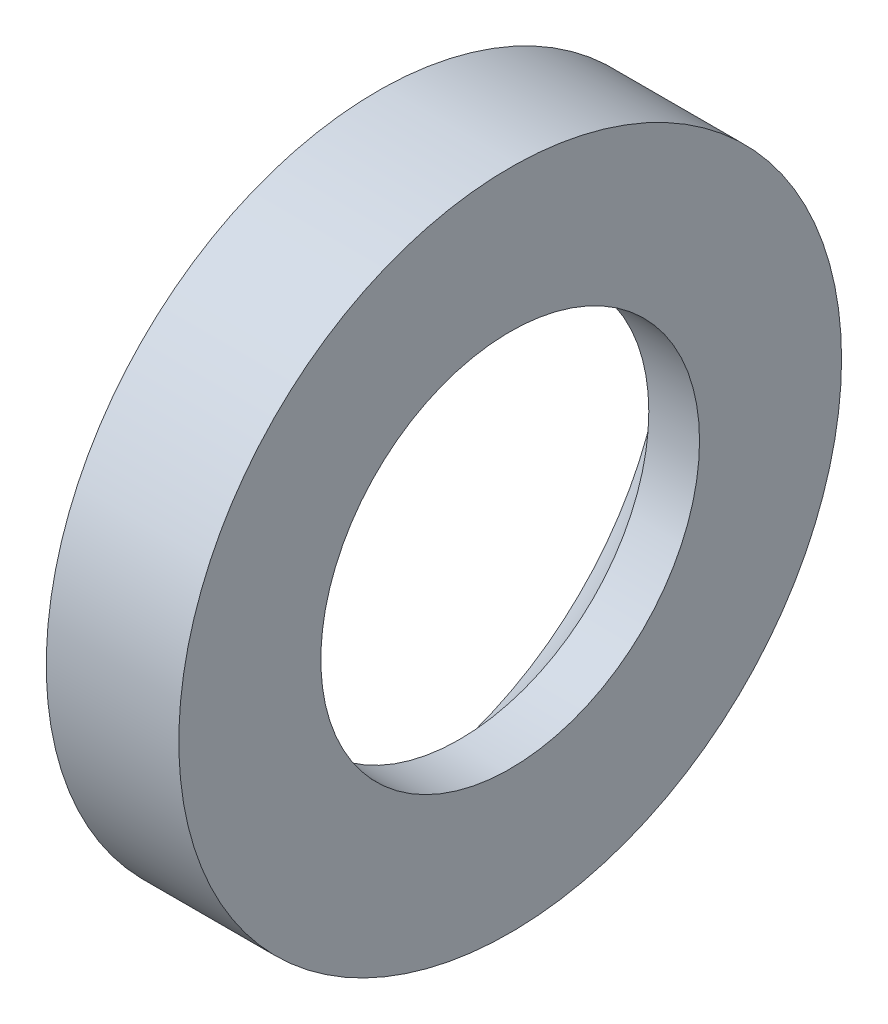
ISO-10303-21;
HEADER;
FILE_DESCRIPTION(('STEP AP214'),'2;1');
FILE_NAME('part.step','',(''),(''),'','','');
FILE_SCHEMA(('AUTOMOTIVE_DESIGN { 1 0 10303 214 1 1 1 1 }'));
ENDSEC;
DATA;
#1=APPLICATION_CONTEXT('core data for automotive mechanical design processes');
#2=APPLICATION_PROTOCOL_DEFINITION('international standard','automotive_design',2000,#1);
#3=PRODUCT_CONTEXT('',#1,'mechanical');
#4=PRODUCT('Part','Part','',(#3));
#5=PRODUCT_RELATED_PRODUCT_CATEGORY('part','',(#4));
#6=PRODUCT_DEFINITION_FORMATION('','',#4);
#7=PRODUCT_DEFINITION_CONTEXT('part definition',#1,'design');
#8=PRODUCT_DEFINITION('design','',#6,#7);
#9=PRODUCT_DEFINITION_SHAPE('','',#8);
#10=(LENGTH_UNIT() NAMED_UNIT(*) SI_UNIT(.MILLI.,.METRE.));
#11=(NAMED_UNIT(*) PLANE_ANGLE_UNIT() SI_UNIT($,.RADIAN.));
#12=(NAMED_UNIT(*) SI_UNIT($,.STERADIAN.) SOLID_ANGLE_UNIT());
#13=UNCERTAINTY_MEASURE_WITH_UNIT(LENGTH_MEASURE(1.E-05),#10,'distance_accuracy_value','');
#14=(GEOMETRIC_REPRESENTATION_CONTEXT(3) GLOBAL_UNCERTAINTY_ASSIGNED_CONTEXT((#13)) GLOBAL_UNIT_ASSIGNED_CONTEXT((#10,
#11,#12)) REPRESENTATION_CONTEXT('',''));
#15=CARTESIAN_POINT('',(0.,0.,0.));
#16=DIRECTION('',(0.,0.,1.));
#17=DIRECTION('',(1.,0.,0.));
#18=AXIS2_PLACEMENT_3D('',#15,#16,#17);
#19=CARTESIAN_POINT('',(7.,0.,0.));
#20=DIRECTION('',(-1.,0.,0.));
#21=DIRECTION('',(0.,0.,1.));
#22=AXIS2_PLACEMENT_3D('',#19,#20,#21);
#23=CYLINDRICAL_SURFACE('',#22,17.5);
#24=CARTESIAN_POINT('',(7.,0.,0.));
#25=DIRECTION('',(1.,0.,0.));
#26=DIRECTION('',(0.,0.,-1.));
#27=AXIS2_PLACEMENT_3D('',#24,#25,#26);
#28=CIRCLE('',#27,17.5);
#29=CARTESIAN_POINT('',(7.,0.,-17.5));
#30=VERTEX_POINT('',#29);
#31=EDGE_CURVE('E10',#30,#30,#28,.T.);
#32=ORIENTED_EDGE('',*,*,#31,.F.);
#33=EDGE_LOOP('',(#32));
#34=FACE_BOUND('',#33,.T.);
#35=CARTESIAN_POINT('',(0.,0.,0.));
#36=DIRECTION('',(1.,0.,0.));
#37=DIRECTION('',(0.,0.,-1.));
#38=AXIS2_PLACEMENT_3D('',#35,#36,#37);
#39=CIRCLE('',#38,17.5);
#40=CARTESIAN_POINT('',(0.,0.,-17.5));
#41=VERTEX_POINT('',#40);
#42=EDGE_CURVE('E22',#41,#41,#39,.T.);
#43=ORIENTED_EDGE('',*,*,#42,.T.);
#44=EDGE_LOOP('',(#43));
#45=FACE_BOUND('',#44,.T.);
#46=ADVANCED_FACE('F14',(#34,#45),#23,.T.);
#47=CARTESIAN_POINT('',(7.,0.,0.));
#48=DIRECTION('',(1.,0.,0.));
#49=DIRECTION('',(0.,0.,-1.));
#50=AXIS2_PLACEMENT_3D('',#47,#48,#49);
#51=PLANE('',#50);
#52=CARTESIAN_POINT('',(7.,0.,0.));
#53=DIRECTION('',(1.,0.,0.));
#54=DIRECTION('',(0.,0.,-1.));
#55=AXIS2_PLACEMENT_3D('',#52,#53,#54);
#56=CIRCLE('',#55,10.);
#57=CARTESIAN_POINT('',(7.,0.,-10.));
#58=VERTEX_POINT('',#57);
#59=EDGE_CURVE('E30',#58,#58,#56,.T.);
#60=ORIENTED_EDGE('',*,*,#59,.F.);
#61=EDGE_LOOP('',(#60));
#62=FACE_BOUND('',#61,.T.);
#63=ORIENTED_EDGE('',*,*,#31,.T.);
#64=EDGE_LOOP('',(#63));
#65=FACE_BOUND('',#64,.T.);
#66=ADVANCED_FACE('F55',(#62,#65),#51,.T.);
#67=CARTESIAN_POINT('',(0.,0.,0.));
#68=DIRECTION('',(1.,0.,0.));
#69=DIRECTION('',(0.,0.,-1.));
#70=AXIS2_PLACEMENT_3D('',#67,#68,#69);
#71=PLANE('',#70);
#72=CARTESIAN_POINT('',(0.,0.,0.));
#73=DIRECTION('',(1.,0.,0.));
#74=DIRECTION('',(0.,0.,-1.));
#75=AXIS2_PLACEMENT_3D('',#72,#73,#74);
#76=CIRCLE('',#75,15.1986841535707);
#77=CARTESIAN_POINT('',(0.,0.,-15.1986841535707));
#78=VERTEX_POINT('',#77);
#79=EDGE_CURVE('E34',#78,#78,#76,.T.);
#80=ORIENTED_EDGE('',*,*,#79,.T.);
#81=EDGE_LOOP('',(#80));
#82=FACE_BOUND('',#81,.T.);
#83=ORIENTED_EDGE('',*,*,#42,.F.);
#84=EDGE_LOOP('',(#83));
#85=FACE_BOUND('',#84,.T.);
#86=ADVANCED_FACE('F53',(#82,#85),#71,.F.);
#87=CARTESIAN_POINT('',(0.,0.,0.));
#88=DIRECTION('',(1.,0.,0.));
#89=DIRECTION('',(0.,0.,-1.));
#90=AXIS2_PLACEMENT_3D('',#87,#88,#89);
#91=CYLINDRICAL_SURFACE('',#90,10.);
#92=CARTESIAN_POINT('',(4.32050807568877,0.,0.));
#93=DIRECTION('',(-1.,0.,0.));
#94=DIRECTION('',(0.,0.,1.));
#95=AXIS2_PLACEMENT_3D('',#92,#93,#94);
#96=CIRCLE('',#95,10.);
#97=CARTESIAN_POINT('',(4.32050807568877,0.,10.));
#98=VERTEX_POINT('',#97);
#99=EDGE_CURVE('E17',#98,#98,#96,.T.);
#100=ORIENTED_EDGE('',*,*,#99,.T.);
#101=EDGE_LOOP('',(#100));
#102=FACE_BOUND('',#101,.T.);
#103=ORIENTED_EDGE('',*,*,#59,.T.);
#104=EDGE_LOOP('',(#103));
#105=FACE_BOUND('',#104,.T.);
#106=ADVANCED_FACE('F42',(#102,#105),#91,.F.);
#107=CARTESIAN_POINT('',(-13.,0.,0.));
#108=DIRECTION('',(0.,-1.,0.));
#109=DIRECTION('',(-1.,0.,0.));
#110=AXIS2_PLACEMENT_3D('',#107,#108,#109);
#111=SPHERICAL_SURFACE('',#110,20.);
#112=CARTESIAN_POINT('',(-13.,0.,0.));
#113=DIRECTION('',(-1.,0.,0.));
#114=DIRECTION('',(0.,0.,1.));
#115=AXIS2_PLACEMENT_3D('',#112,#113,#114);
#116=SPHERICAL_SURFACE('',#115,20.);
#117=ORIENTED_EDGE('',*,*,#99,.F.);
#118=EDGE_LOOP('',(#117));
#119=FACE_BOUND('',#118,.T.);
#120=ORIENTED_EDGE('',*,*,#79,.F.);
#121=EDGE_LOOP('',(#120));
#122=FACE_BOUND('',#121,.T.);
#123=ADVANCED_FACE('F45',(#119,#122),#116,.F.);
#124=CLOSED_SHELL('',(#46,#66,#86,#106,#123));
#125=MANIFOLD_SOLID_BREP('B1',#124);
#126=ADVANCED_BREP_SHAPE_REPRESENTATION('',(#18,#125),#14);
#127=SHAPE_DEFINITION_REPRESENTATION(#9,#126);
ENDSEC;
END-ISO-10303-21;
